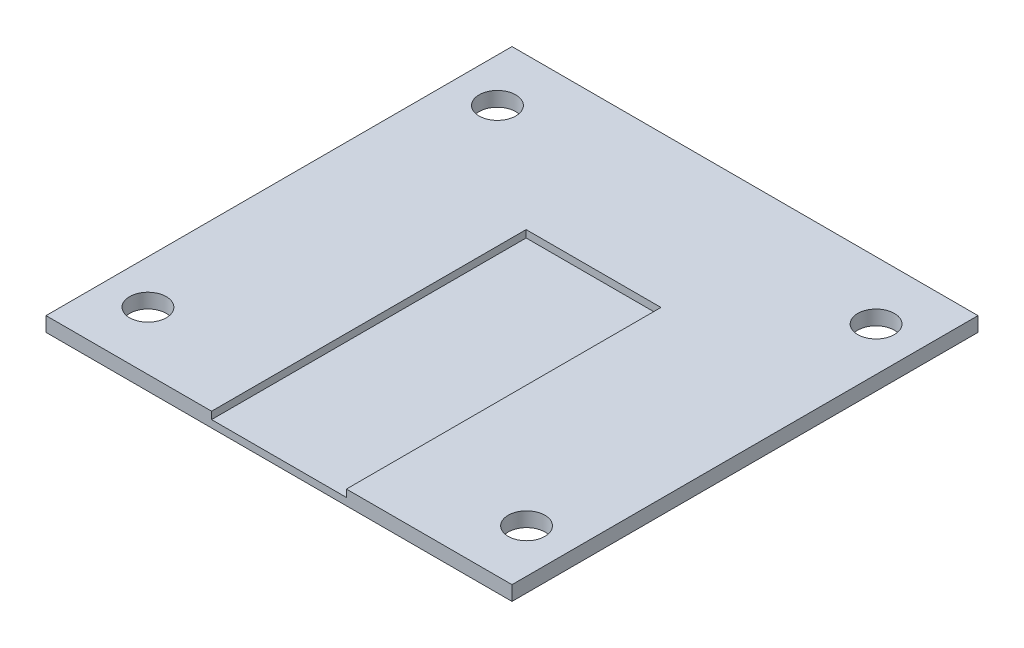
ISO-10303-21;
HEADER;
FILE_DESCRIPTION(('STEP AP214'),'2;1');
FILE_NAME('part.step','',(''),(''),'','','');
FILE_SCHEMA(('AUTOMOTIVE_DESIGN { 1 0 10303 214 1 1 1 1 }'));
ENDSEC;
DATA;
#1=APPLICATION_CONTEXT('core data for automotive mechanical design processes');
#2=APPLICATION_PROTOCOL_DEFINITION('international standard','automotive_design',2000,#1);
#3=PRODUCT_CONTEXT('',#1,'mechanical');
#4=PRODUCT('Part','Part','',(#3));
#5=PRODUCT_RELATED_PRODUCT_CATEGORY('part','',(#4));
#6=PRODUCT_DEFINITION_FORMATION('','',#4);
#7=PRODUCT_DEFINITION_CONTEXT('part definition',#1,'design');
#8=PRODUCT_DEFINITION('design','',#6,#7);
#9=PRODUCT_DEFINITION_SHAPE('','',#8);
#10=(LENGTH_UNIT() NAMED_UNIT(*) SI_UNIT(.MILLI.,.METRE.));
#11=(NAMED_UNIT(*) PLANE_ANGLE_UNIT() SI_UNIT($,.RADIAN.));
#12=(NAMED_UNIT(*) SI_UNIT($,.STERADIAN.) SOLID_ANGLE_UNIT());
#13=UNCERTAINTY_MEASURE_WITH_UNIT(LENGTH_MEASURE(1.E-05),#10,'distance_accuracy_value','');
#14=(GEOMETRIC_REPRESENTATION_CONTEXT(3) GLOBAL_UNCERTAINTY_ASSIGNED_CONTEXT((#13)) GLOBAL_UNIT_ASSIGNED_CONTEXT((#10,
#11,#12)) REPRESENTATION_CONTEXT('',''));
#15=CARTESIAN_POINT('',(0.,0.,0.));
#16=DIRECTION('',(0.,0.,1.));
#17=DIRECTION('',(1.,0.,0.));
#18=AXIS2_PLACEMENT_3D('',#15,#16,#17);
#19=CARTESIAN_POINT('',(0.,0.,0.));
#20=DIRECTION('',(0.,1.,0.));
#21=DIRECTION('',(0.,0.,1.));
#22=AXIS2_PLACEMENT_3D('',#19,#20,#21);
#23=PLANE('',#22);
#24=CARTESIAN_POINT('',(-20.6375,0.,-19.05));
#25=DIRECTION('',(0.,-1.,0.));
#26=DIRECTION('',(0.,0.,-1.));
#27=AXIS2_PLACEMENT_3D('',#24,#25,#26);
#28=CIRCLE('',#27,2.);
#29=CARTESIAN_POINT('',(-20.6375,0.,-21.05));
#30=VERTEX_POINT('',#29);
#31=EDGE_CURVE('E154',#30,#30,#28,.T.);
#32=ORIENTED_EDGE('',*,*,#31,.T.);
#33=EDGE_LOOP('',(#32));
#34=FACE_BOUND('',#33,.T.);
#35=CARTESIAN_POINT('',(20.6375,0.,19.05));
#36=DIRECTION('',(0.,-1.,0.));
#37=DIRECTION('',(0.,0.,-1.));
#38=AXIS2_PLACEMENT_3D('',#35,#36,#37);
#39=CIRCLE('',#38,2.);
#40=CARTESIAN_POINT('',(20.6375,0.,17.05));
#41=VERTEX_POINT('',#40);
#42=EDGE_CURVE('E160',#41,#41,#39,.T.);
#43=ORIENTED_EDGE('',*,*,#42,.T.);
#44=EDGE_LOOP('',(#43));
#45=FACE_BOUND('',#44,.T.);
#46=DIRECTION('',(0.,0.,-1.));
#47=VECTOR('',#46,1.);
#48=CARTESIAN_POINT('',(7.35,0.,25.4));
#49=LINE('',#48,#47);
#50=CARTESIAN_POINT('',(7.35,0.,25.4));
#51=VERTEX_POINT('',#50);
#52=CARTESIAN_POINT('',(7.35,0.,-8.89));
#53=VERTEX_POINT('',#52);
#54=EDGE_CURVE('E163',#51,#53,#49,.T.);
#55=ORIENTED_EDGE('',*,*,#54,.F.);
#56=DIRECTION('',(-1.,0.,0.));
#57=VECTOR('',#56,1.);
#58=CARTESIAN_POINT('',(25.4,0.,25.4));
#59=LINE('',#58,#57);
#60=CARTESIAN_POINT('',(25.4,0.,25.4));
#61=VERTEX_POINT('',#60);
#62=EDGE_CURVE('E94',#61,#51,#59,.T.);
#63=ORIENTED_EDGE('',*,*,#62,.F.);
#64=DIRECTION('',(0.,0.,1.));
#65=VECTOR('',#64,1.);
#66=CARTESIAN_POINT('',(25.4,0.,-25.4));
#67=LINE('',#66,#65);
#68=CARTESIAN_POINT('',(25.4,0.,-25.4));
#69=VERTEX_POINT('',#68);
#70=EDGE_CURVE('E91',#69,#61,#67,.T.);
#71=ORIENTED_EDGE('',*,*,#70,.F.);
#72=DIRECTION('',(1.,0.,0.));
#73=VECTOR('',#72,1.);
#74=CARTESIAN_POINT('',(-25.4,0.,-25.4));
#75=LINE('',#74,#73);
#76=CARTESIAN_POINT('',(-25.4,0.,-25.4));
#77=VERTEX_POINT('',#76);
#78=EDGE_CURVE('E180',#77,#69,#75,.T.);
#79=ORIENTED_EDGE('',*,*,#78,.F.);
#80=DIRECTION('',(0.,0.,-1.));
#81=VECTOR('',#80,1.);
#82=CARTESIAN_POINT('',(-25.4,0.,25.4));
#83=LINE('',#82,#81);
#84=CARTESIAN_POINT('',(-25.4,0.,25.4));
#85=VERTEX_POINT('',#84);
#86=EDGE_CURVE('E123',#85,#77,#83,.T.);
#87=ORIENTED_EDGE('',*,*,#86,.F.);
#88=DIRECTION('',(-1.,0.,0.));
#89=VECTOR('',#88,1.);
#90=CARTESIAN_POINT('',(-7.35,0.,25.4));
#91=LINE('',#90,#89);
#92=CARTESIAN_POINT('',(-7.35,0.,25.4));
#93=VERTEX_POINT('',#92);
#94=EDGE_CURVE('E177',#93,#85,#91,.T.);
#95=ORIENTED_EDGE('',*,*,#94,.F.);
#96=DIRECTION('',(0.,0.,1.));
#97=VECTOR('',#96,1.);
#98=CARTESIAN_POINT('',(-7.35,0.,-8.89));
#99=LINE('',#98,#97);
#100=CARTESIAN_POINT('',(-7.35,0.,-8.89));
#101=VERTEX_POINT('',#100);
#102=EDGE_CURVE('E175',#101,#93,#99,.T.);
#103=ORIENTED_EDGE('',*,*,#102,.F.);
#104=DIRECTION('',(-1.,0.,0.));
#105=VECTOR('',#104,1.);
#106=CARTESIAN_POINT('',(-6.35,0.,-8.89));
#107=LINE('',#106,#105);
#108=EDGE_CURVE('E173',#53,#101,#107,.T.);
#109=ORIENTED_EDGE('',*,*,#108,.F.);
#110=EDGE_LOOP('',(#55,#63,#71,#79,#87,#95,#103,#109));
#111=FACE_BOUND('',#110,.T.);
#112=CARTESIAN_POINT('',(20.6375,0.,-19.05));
#113=DIRECTION('',(0.,-1.,0.));
#114=DIRECTION('',(0.,0.,-1.));
#115=AXIS2_PLACEMENT_3D('',#112,#113,#114);
#116=CIRCLE('',#115,2.);
#117=CARTESIAN_POINT('',(20.6375,0.,-21.05));
#118=VERTEX_POINT('',#117);
#119=EDGE_CURVE('E157',#118,#118,#116,.T.);
#120=ORIENTED_EDGE('',*,*,#119,.T.);
#121=EDGE_LOOP('',(#120));
#122=FACE_BOUND('',#121,.T.);
#123=CARTESIAN_POINT('',(-20.6375,0.,19.05));
#124=DIRECTION('',(0.,-1.,0.));
#125=DIRECTION('',(0.,0.,-1.));
#126=AXIS2_PLACEMENT_3D('',#123,#124,#125);
#127=CIRCLE('',#126,2.);
#128=CARTESIAN_POINT('',(-20.6375,0.,17.05));
#129=VERTEX_POINT('',#128);
#130=EDGE_CURVE('E150',#129,#129,#127,.T.);
#131=ORIENTED_EDGE('',*,*,#130,.T.);
#132=EDGE_LOOP('',(#131));
#133=FACE_BOUND('',#132,.T.);
#134=ADVANCED_FACE('F43',(#34,#45,#111,#122,#133),#23,.T.);
#135=CARTESIAN_POINT('',(7.35,-0.79375,25.4));
#136=DIRECTION('',(1.,0.,0.));
#137=DIRECTION('',(0.,0.,-1.));
#138=AXIS2_PLACEMENT_3D('',#135,#136,#137);
#139=PLANE('',#138);
#140=ORIENTED_EDGE('',*,*,#54,.T.);
#141=DIRECTION('',(0.,1.,0.));
#142=VECTOR('',#141,1.);
#143=CARTESIAN_POINT('',(7.35,-0.79375,-8.89));
#144=LINE('',#143,#142);
#145=CARTESIAN_POINT('',(7.35,-0.79375,-8.89));
#146=VERTEX_POINT('',#145);
#147=EDGE_CURVE('E11',#146,#53,#144,.T.);
#148=ORIENTED_EDGE('',*,*,#147,.F.);
#149=DIRECTION('',(0.,0.,-1.));
#150=VECTOR('',#149,1.);
#151=CARTESIAN_POINT('',(7.35,-0.79375,25.4));
#152=LINE('',#151,#150);
#153=CARTESIAN_POINT('',(7.35,-0.79375,25.4));
#154=VERTEX_POINT('',#153);
#155=EDGE_CURVE('E164',#154,#146,#152,.T.);
#156=ORIENTED_EDGE('',*,*,#155,.F.);
#157=DIRECTION('',(0.,1.,0.));
#158=VECTOR('',#157,1.);
#159=CARTESIAN_POINT('',(7.35,-0.79375,25.4));
#160=LINE('',#159,#158);
#161=EDGE_CURVE('E60',#154,#51,#160,.T.);
#162=ORIENTED_EDGE('',*,*,#161,.T.);
#163=EDGE_LOOP('',(#140,#148,#156,#162));
#164=FACE_BOUND('',#163,.T.);
#165=ADVANCED_FACE('F45',(#164),#139,.F.);
#166=CARTESIAN_POINT('',(-6.35,-0.79375,-8.89));
#167=DIRECTION('',(0.,0.,-1.));
#168=DIRECTION('',(-1.,0.,0.));
#169=AXIS2_PLACEMENT_3D('',#166,#167,#168);
#170=PLANE('',#169);
#171=ORIENTED_EDGE('',*,*,#108,.T.);
#172=DIRECTION('',(0.,1.,0.));
#173=VECTOR('',#172,1.);
#174=CARTESIAN_POINT('',(-7.35,-0.79375,-8.89));
#175=LINE('',#174,#173);
#176=CARTESIAN_POINT('',(-7.35,-0.79375,-8.89));
#177=VERTEX_POINT('',#176);
#178=EDGE_CURVE('E52',#177,#101,#175,.T.);
#179=ORIENTED_EDGE('',*,*,#178,.F.);
#180=DIRECTION('',(-1.,0.,0.));
#181=VECTOR('',#180,1.);
#182=CARTESIAN_POINT('',(7.35,-0.79375,-8.89));
#183=LINE('',#182,#181);
#184=EDGE_CURVE('E98',#146,#177,#183,.T.);
#185=ORIENTED_EDGE('',*,*,#184,.F.);
#186=ORIENTED_EDGE('',*,*,#147,.T.);
#187=EDGE_LOOP('',(#171,#179,#185,#186));
#188=FACE_BOUND('',#187,.T.);
#189=ADVANCED_FACE('F205',(#188),#170,.F.);
#190=CARTESIAN_POINT('',(-7.35,-0.79375,-8.89));
#191=DIRECTION('',(-1.,0.,0.));
#192=DIRECTION('',(0.,0.,1.));
#193=AXIS2_PLACEMENT_3D('',#190,#191,#192);
#194=PLANE('',#193);
#195=ORIENTED_EDGE('',*,*,#102,.T.);
#196=DIRECTION('',(0.,1.,0.));
#197=VECTOR('',#196,1.);
#198=CARTESIAN_POINT('',(-7.35,-0.79375,25.4));
#199=LINE('',#198,#197);
#200=CARTESIAN_POINT('',(-7.35,-0.79375,25.4));
#201=VERTEX_POINT('',#200);
#202=EDGE_CURVE('E189',#201,#93,#199,.T.);
#203=ORIENTED_EDGE('',*,*,#202,.F.);
#204=DIRECTION('',(0.,0.,1.));
#205=VECTOR('',#204,1.);
#206=CARTESIAN_POINT('',(-7.35,-0.79375,-8.89));
#207=LINE('',#206,#205);
#208=EDGE_CURVE('E168',#177,#201,#207,.T.);
#209=ORIENTED_EDGE('',*,*,#208,.F.);
#210=ORIENTED_EDGE('',*,*,#178,.T.);
#211=EDGE_LOOP('',(#195,#203,#209,#210));
#212=FACE_BOUND('',#211,.T.);
#213=ADVANCED_FACE('F195',(#212),#194,.F.);
#214=CARTESIAN_POINT('',(-25.4,-0.79375,25.4));
#215=DIRECTION('',(1.,0.,0.));
#216=DIRECTION('',(0.,0.,-1.));
#217=AXIS2_PLACEMENT_3D('',#214,#215,#216);
#218=PLANE('',#217);
#219=ORIENTED_EDGE('',*,*,#86,.T.);
#220=DIRECTION('',(0.,1.,0.));
#221=VECTOR('',#220,1.);
#222=CARTESIAN_POINT('',(-25.4,-0.79375,-25.4));
#223=LINE('',#222,#221);
#224=CARTESIAN_POINT('',(-25.4,-1.5875,-25.4));
#225=VERTEX_POINT('',#224);
#226=EDGE_CURVE('E116',#225,#77,#223,.T.);
#227=ORIENTED_EDGE('',*,*,#226,.F.);
#228=DIRECTION('',(0.,0.,-1.));
#229=VECTOR('',#228,1.);
#230=CARTESIAN_POINT('',(-25.4,-1.5875,-25.4));
#231=LINE('',#230,#229);
#232=CARTESIAN_POINT('',(-25.4,-1.5875,25.4));
#233=VERTEX_POINT('',#232);
#234=EDGE_CURVE('E121',#233,#225,#231,.T.);
#235=ORIENTED_EDGE('',*,*,#234,.F.);
#236=DIRECTION('',(0.,1.,0.));
#237=VECTOR('',#236,1.);
#238=CARTESIAN_POINT('',(-25.4,-0.79375,25.4));
#239=LINE('',#238,#237);
#240=EDGE_CURVE('E126',#233,#85,#239,.T.);
#241=ORIENTED_EDGE('',*,*,#240,.T.);
#242=EDGE_LOOP('',(#219,#227,#235,#241));
#243=FACE_BOUND('',#242,.T.);
#244=ADVANCED_FACE('F118',(#243),#218,.F.);
#245=CARTESIAN_POINT('',(-25.4,-0.79375,-25.4));
#246=DIRECTION('',(0.,0.,1.));
#247=DIRECTION('',(1.,0.,0.));
#248=AXIS2_PLACEMENT_3D('',#245,#246,#247);
#249=PLANE('',#248);
#250=ORIENTED_EDGE('',*,*,#78,.T.);
#251=DIRECTION('',(0.,1.,0.));
#252=VECTOR('',#251,1.);
#253=CARTESIAN_POINT('',(25.4,-0.79375,-25.4));
#254=LINE('',#253,#252);
#255=CARTESIAN_POINT('',(25.4,-1.5875,-25.4));
#256=VERTEX_POINT('',#255);
#257=EDGE_CURVE('E127',#256,#69,#254,.T.);
#258=ORIENTED_EDGE('',*,*,#257,.F.);
#259=DIRECTION('',(1.,0.,0.));
#260=VECTOR('',#259,1.);
#261=CARTESIAN_POINT('',(-25.4,-1.5875,-25.4));
#262=LINE('',#261,#260);
#263=EDGE_CURVE('E130',#225,#256,#262,.T.);
#264=ORIENTED_EDGE('',*,*,#263,.F.);
#265=ORIENTED_EDGE('',*,*,#226,.T.);
#266=EDGE_LOOP('',(#250,#258,#264,#265));
#267=FACE_BOUND('',#266,.T.);
#268=ADVANCED_FACE('F131',(#267),#249,.F.);
#269=CARTESIAN_POINT('',(25.4,-0.79375,-25.4));
#270=DIRECTION('',(-1.,0.,0.));
#271=DIRECTION('',(0.,0.,1.));
#272=AXIS2_PLACEMENT_3D('',#269,#270,#271);
#273=PLANE('',#272);
#274=ORIENTED_EDGE('',*,*,#70,.T.);
#275=DIRECTION('',(0.,1.,0.));
#276=VECTOR('',#275,1.);
#277=CARTESIAN_POINT('',(25.4,-0.79375,25.4));
#278=LINE('',#277,#276);
#279=CARTESIAN_POINT('',(25.4,-1.5875,25.4));
#280=VERTEX_POINT('',#279);
#281=EDGE_CURVE('E185',#280,#61,#278,.T.);
#282=ORIENTED_EDGE('',*,*,#281,.F.);
#283=DIRECTION('',(0.,0.,1.));
#284=VECTOR('',#283,1.);
#285=CARTESIAN_POINT('',(25.4,-1.5875,-25.4));
#286=LINE('',#285,#284);
#287=EDGE_CURVE('E135',#256,#280,#286,.T.);
#288=ORIENTED_EDGE('',*,*,#287,.F.);
#289=ORIENTED_EDGE('',*,*,#257,.T.);
#290=EDGE_LOOP('',(#274,#282,#288,#289));
#291=FACE_BOUND('',#290,.T.);
#292=ADVANCED_FACE('F226',(#291),#273,.F.);
#293=CARTESIAN_POINT('',(25.4,-0.79375,25.4));
#294=DIRECTION('',(0.,0.,-1.));
#295=DIRECTION('',(-1.,0.,0.));
#296=AXIS2_PLACEMENT_3D('',#293,#294,#295);
#297=PLANE('',#296);
#298=ORIENTED_EDGE('',*,*,#62,.T.);
#299=ORIENTED_EDGE('',*,*,#161,.F.);
#300=DIRECTION('',(-1.,0.,0.));
#301=VECTOR('',#300,1.);
#302=CARTESIAN_POINT('',(-25.4,-0.79375,25.4));
#303=LINE('',#302,#301);
#304=EDGE_CURVE('E142',#154,#201,#303,.T.);
#305=ORIENTED_EDGE('',*,*,#304,.T.);
#306=ORIENTED_EDGE('',*,*,#202,.T.);
#307=ORIENTED_EDGE('',*,*,#94,.T.);
#308=ORIENTED_EDGE('',*,*,#240,.F.);
#309=DIRECTION('',(-1.,0.,0.));
#310=VECTOR('',#309,1.);
#311=CARTESIAN_POINT('',(-25.4,-1.5875,25.4));
#312=LINE('',#311,#310);
#313=EDGE_CURVE('E141',#280,#233,#312,.T.);
#314=ORIENTED_EDGE('',*,*,#313,.F.);
#315=ORIENTED_EDGE('',*,*,#281,.T.);
#316=EDGE_LOOP('',(#298,#299,#305,#306,#307,#308,#314,#315));
#317=FACE_BOUND('',#316,.T.);
#318=ADVANCED_FACE('F200',(#317),#297,.F.);
#319=CARTESIAN_POINT('',(20.6375,-0.79375,19.05));
#320=DIRECTION('',(0.,1.,0.));
#321=DIRECTION('',(0.,0.,1.));
#322=AXIS2_PLACEMENT_3D('',#319,#320,#321);
#323=CYLINDRICAL_SURFACE('',#322,2.);
#324=ORIENTED_EDGE('',*,*,#42,.F.);
#325=EDGE_LOOP('',(#324));
#326=FACE_BOUND('',#325,.T.);
#327=CARTESIAN_POINT('',(20.6375,-1.5875,19.05));
#328=DIRECTION('',(0.,-1.,0.));
#329=DIRECTION('',(0.,0.,-1.));
#330=AXIS2_PLACEMENT_3D('',#327,#328,#329);
#331=CIRCLE('',#330,2.);
#332=CARTESIAN_POINT('',(20.6375,-1.5875,17.05));
#333=VERTEX_POINT('',#332);
#334=EDGE_CURVE('E366',#333,#333,#331,.T.);
#335=ORIENTED_EDGE('',*,*,#334,.T.);
#336=EDGE_LOOP('',(#335));
#337=FACE_BOUND('',#336,.T.);
#338=ADVANCED_FACE('F222',(#326,#337),#323,.F.);
#339=CARTESIAN_POINT('',(20.6375,-0.79375,-19.05));
#340=DIRECTION('',(0.,1.,0.));
#341=DIRECTION('',(0.,0.,1.));
#342=AXIS2_PLACEMENT_3D('',#339,#340,#341);
#343=CYLINDRICAL_SURFACE('',#342,2.);
#344=ORIENTED_EDGE('',*,*,#119,.F.);
#345=EDGE_LOOP('',(#344));
#346=FACE_BOUND('',#345,.T.);
#347=CARTESIAN_POINT('',(20.6375,-1.5875,-19.05));
#348=DIRECTION('',(0.,-1.,0.));
#349=DIRECTION('',(0.,0.,-1.));
#350=AXIS2_PLACEMENT_3D('',#347,#348,#349);
#351=CIRCLE('',#350,2.);
#352=CARTESIAN_POINT('',(20.6375,-1.5875,-21.05));
#353=VERTEX_POINT('',#352);
#354=EDGE_CURVE('E369',#353,#353,#351,.T.);
#355=ORIENTED_EDGE('',*,*,#354,.T.);
#356=EDGE_LOOP('',(#355));
#357=FACE_BOUND('',#356,.T.);
#358=ADVANCED_FACE('F270',(#346,#357),#343,.F.);
#359=CARTESIAN_POINT('',(-20.6375,-0.79375,-19.05));
#360=DIRECTION('',(0.,1.,0.));
#361=DIRECTION('',(0.,0.,1.));
#362=AXIS2_PLACEMENT_3D('',#359,#360,#361);
#363=CYLINDRICAL_SURFACE('',#362,2.);
#364=ORIENTED_EDGE('',*,*,#31,.F.);
#365=EDGE_LOOP('',(#364));
#366=FACE_BOUND('',#365,.T.);
#367=CARTESIAN_POINT('',(-20.6375,-1.5875,-19.05));
#368=DIRECTION('',(0.,-1.,0.));
#369=DIRECTION('',(0.,0.,-1.));
#370=AXIS2_PLACEMENT_3D('',#367,#368,#369);
#371=CIRCLE('',#370,2.);
#372=CARTESIAN_POINT('',(-20.6375,-1.5875,-21.05));
#373=VERTEX_POINT('',#372);
#374=EDGE_CURVE('E144',#373,#373,#371,.T.);
#375=ORIENTED_EDGE('',*,*,#374,.T.);
#376=EDGE_LOOP('',(#375));
#377=FACE_BOUND('',#376,.T.);
#378=ADVANCED_FACE('F281',(#366,#377),#363,.F.);
#379=CARTESIAN_POINT('',(-20.6375,-0.79375,19.05));
#380=DIRECTION('',(0.,1.,0.));
#381=DIRECTION('',(0.,0.,1.));
#382=AXIS2_PLACEMENT_3D('',#379,#380,#381);
#383=CYLINDRICAL_SURFACE('',#382,2.);
#384=ORIENTED_EDGE('',*,*,#130,.F.);
#385=EDGE_LOOP('',(#384));
#386=FACE_BOUND('',#385,.T.);
#387=CARTESIAN_POINT('',(-20.6375,-1.5875,19.05));
#388=DIRECTION('',(0.,-1.,0.));
#389=DIRECTION('',(0.,0.,-1.));
#390=AXIS2_PLACEMENT_3D('',#387,#388,#389);
#391=CIRCLE('',#390,2.);
#392=CARTESIAN_POINT('',(-20.6375,-1.5875,17.05));
#393=VERTEX_POINT('',#392);
#394=EDGE_CURVE('E364',#393,#393,#391,.T.);
#395=ORIENTED_EDGE('',*,*,#394,.T.);
#396=EDGE_LOOP('',(#395));
#397=FACE_BOUND('',#396,.T.);
#398=ADVANCED_FACE('F292',(#386,#397),#383,.F.);
#399=CARTESIAN_POINT('',(0.,-1.5875,0.));
#400=DIRECTION('',(0.,1.,0.));
#401=DIRECTION('',(0.,0.,1.));
#402=AXIS2_PLACEMENT_3D('',#399,#400,#401);
#403=PLANE('',#402);
#404=ORIENTED_EDGE('',*,*,#234,.T.);
#405=ORIENTED_EDGE('',*,*,#263,.T.);
#406=ORIENTED_EDGE('',*,*,#287,.T.);
#407=ORIENTED_EDGE('',*,*,#313,.T.);
#408=EDGE_LOOP('',(#404,#405,#406,#407));
#409=FACE_BOUND('',#408,.T.);
#410=ORIENTED_EDGE('',*,*,#374,.F.);
#411=EDGE_LOOP('',(#410));
#412=FACE_BOUND('',#411,.T.);
#413=ORIENTED_EDGE('',*,*,#354,.F.);
#414=EDGE_LOOP('',(#413));
#415=FACE_BOUND('',#414,.T.);
#416=ORIENTED_EDGE('',*,*,#334,.F.);
#417=EDGE_LOOP('',(#416));
#418=FACE_BOUND('',#417,.T.);
#419=ORIENTED_EDGE('',*,*,#394,.F.);
#420=EDGE_LOOP('',(#419));
#421=FACE_BOUND('',#420,.T.);
#422=ADVANCED_FACE('F138',(#409,#412,#415,#418,#421),#403,.F.);
#423=CARTESIAN_POINT('',(0.,-0.79375,0.));
#424=DIRECTION('',(0.,1.,0.));
#425=DIRECTION('',(0.,0.,1.));
#426=AXIS2_PLACEMENT_3D('',#423,#424,#425);
#427=PLANE('',#426);
#428=ORIENTED_EDGE('',*,*,#304,.F.);
#429=ORIENTED_EDGE('',*,*,#155,.T.);
#430=ORIENTED_EDGE('',*,*,#184,.T.);
#431=ORIENTED_EDGE('',*,*,#208,.T.);
#432=EDGE_LOOP('',(#428,#429,#430,#431));
#433=FACE_BOUND('',#432,.T.);
#434=ADVANCED_FACE('F203',(#433),#427,.T.);
#435=CLOSED_SHELL('',(#134,#165,#189,#213,#244,#268,#292,#318,#338,#358,#378,#398,#422,#434));
#436=MANIFOLD_SOLID_BREP('B2',#435);
#437=ADVANCED_BREP_SHAPE_REPRESENTATION('',(#18,#436),#14);
#438=SHAPE_DEFINITION_REPRESENTATION(#9,#437);
ENDSEC;
END-ISO-10303-21;
